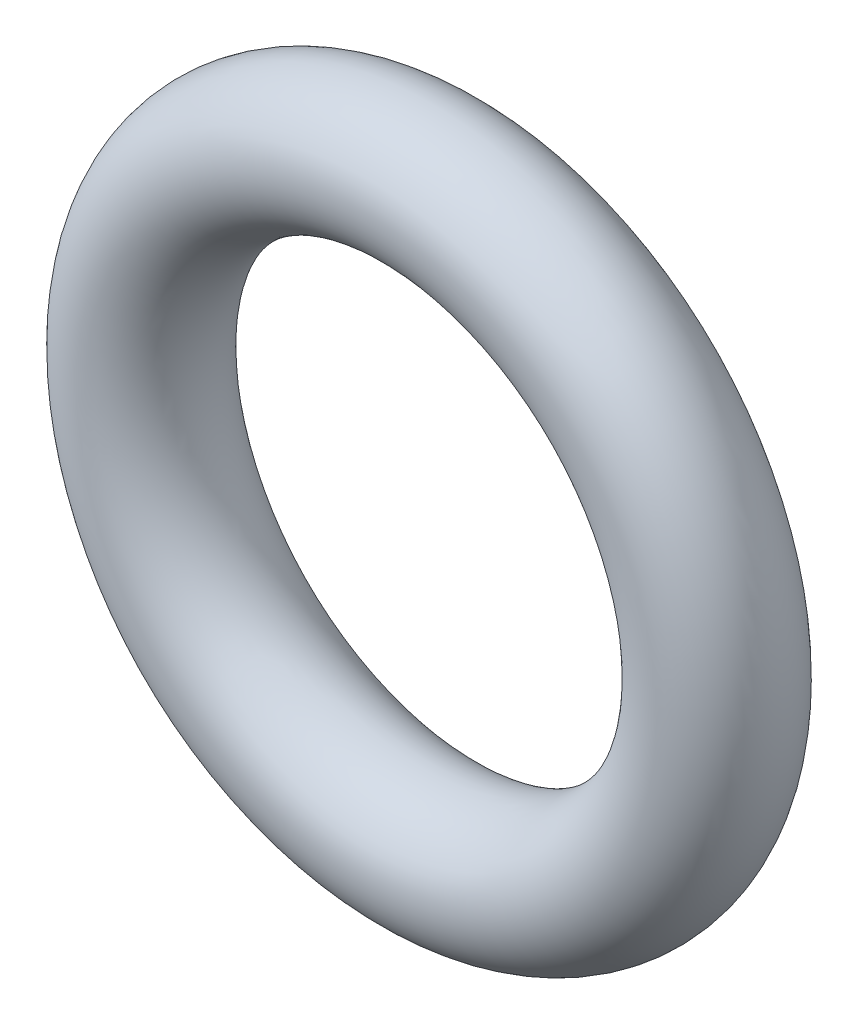
ISO-10303-21;
HEADER;
FILE_DESCRIPTION(('STEP AP214'),'2;1');
FILE_NAME('part.step','',(''),(''),'','','');
FILE_SCHEMA(('AUTOMOTIVE_DESIGN { 1 0 10303 214 1 1 1 1 }'));
ENDSEC;
DATA;
#1=APPLICATION_CONTEXT('core data for automotive mechanical design processes');
#2=APPLICATION_PROTOCOL_DEFINITION('international standard','automotive_design',2000,#1);
#3=PRODUCT_CONTEXT('',#1,'mechanical');
#4=PRODUCT('Part','Part','',(#3));
#5=PRODUCT_RELATED_PRODUCT_CATEGORY('part','',(#4));
#6=PRODUCT_DEFINITION_FORMATION('','',#4);
#7=PRODUCT_DEFINITION_CONTEXT('part definition',#1,'design');
#8=PRODUCT_DEFINITION('design','',#6,#7);
#9=PRODUCT_DEFINITION_SHAPE('','',#8);
#10=(LENGTH_UNIT() NAMED_UNIT(*) SI_UNIT(.MILLI.,.METRE.));
#11=(NAMED_UNIT(*) PLANE_ANGLE_UNIT() SI_UNIT($,.RADIAN.));
#12=(NAMED_UNIT(*) SI_UNIT($,.STERADIAN.) SOLID_ANGLE_UNIT());
#13=UNCERTAINTY_MEASURE_WITH_UNIT(LENGTH_MEASURE(1.E-05),#10,'distance_accuracy_value','');
#14=(GEOMETRIC_REPRESENTATION_CONTEXT(3) GLOBAL_UNCERTAINTY_ASSIGNED_CONTEXT((#13)) GLOBAL_UNIT_ASSIGNED_CONTEXT((#10,
#11,#12)) REPRESENTATION_CONTEXT('',''));
#15=CARTESIAN_POINT('',(0.,0.,0.));
#16=DIRECTION('',(0.,0.,1.));
#17=DIRECTION('',(1.,0.,0.));
#18=AXIS2_PLACEMENT_3D('',#15,#16,#17);
#19=CARTESIAN_POINT('',(0.,0.,0.));
#20=DIRECTION('',(0.,0.,1.));
#21=DIRECTION('',(1.,0.,0.));
#22=AXIS2_PLACEMENT_3D('',#19,#20,#21);
#23=TOROIDAL_SURFACE('',#22,2.15,0.5);
#24=CARTESIAN_POINT('',(2.65,0.,0.));
#25=VERTEX_POINT('',#24);
#26=VERTEX_LOOP('',#25);
#27=FACE_BOUND('',#26,.T.);
#28=ADVANCED_FACE('F28',(#27),#23,.T.);
#29=CLOSED_SHELL('',(#28));
#30=MANIFOLD_SOLID_BREP('B2',#29);
#31=ADVANCED_BREP_SHAPE_REPRESENTATION('',(#18,#30),#14);
#32=SHAPE_DEFINITION_REPRESENTATION(#9,#31);
ENDSEC;
END-ISO-10303-21;
